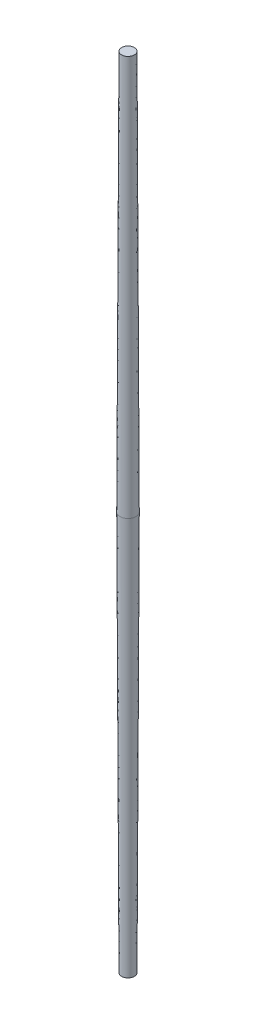
ISO-10303-21;
HEADER;
FILE_DESCRIPTION(('STEP AP214'),'2;1');
FILE_NAME('part.step','',(''),(''),'','','');
FILE_SCHEMA(('AUTOMOTIVE_DESIGN { 1 0 10303 214 1 1 1 1 }'));
ENDSEC;
DATA;
#1=APPLICATION_CONTEXT('core data for automotive mechanical design processes');
#2=APPLICATION_PROTOCOL_DEFINITION('international standard','automotive_design',2000,#1);
#3=PRODUCT_CONTEXT('',#1,'mechanical');
#4=PRODUCT('Part','Part','',(#3));
#5=PRODUCT_RELATED_PRODUCT_CATEGORY('part','',(#4));
#6=PRODUCT_DEFINITION_FORMATION('','',#4);
#7=PRODUCT_DEFINITION_CONTEXT('part definition',#1,'design');
#8=PRODUCT_DEFINITION('design','',#6,#7);
#9=PRODUCT_DEFINITION_SHAPE('','',#8);
#10=(LENGTH_UNIT() NAMED_UNIT(*) SI_UNIT(.MILLI.,.METRE.));
#11=(NAMED_UNIT(*) PLANE_ANGLE_UNIT() SI_UNIT($,.RADIAN.));
#12=(NAMED_UNIT(*) SI_UNIT($,.STERADIAN.) SOLID_ANGLE_UNIT());
#13=UNCERTAINTY_MEASURE_WITH_UNIT(LENGTH_MEASURE(1.E-05),#10,'distance_accuracy_value','');
#14=(GEOMETRIC_REPRESENTATION_CONTEXT(3) GLOBAL_UNCERTAINTY_ASSIGNED_CONTEXT((#13)) GLOBAL_UNIT_ASSIGNED_CONTEXT((#10,
#11,#12)) REPRESENTATION_CONTEXT('',''));
#15=CARTESIAN_POINT('',(0.,0.,0.));
#16=DIRECTION('',(0.,0.,1.));
#17=DIRECTION('',(1.,0.,0.));
#18=AXIS2_PLACEMENT_3D('',#15,#16,#17);
#19=CARTESIAN_POINT('',(0.,0.,0.));
#20=DIRECTION('',(0.,-1.,0.));
#21=DIRECTION('',(1.,0.,0.));
#22=AXIS2_PLACEMENT_3D('',#19,#20,#21);
#23=CONICAL_SURFACE('',#22,7.5,0.00399997866687154);
#24=CARTESIAN_POINT('',(0.,375.,0.));
#25=DIRECTION('',(0.,1.,0.));
#26=DIRECTION('',(-1.,0.,0.));
#27=AXIS2_PLACEMENT_3D('',#24,#25,#26);
#28=CIRCLE('',#27,5.99999999999997);
#29=CARTESIAN_POINT('',(-5.99999999999994,375.,0.));
#30=VERTEX_POINT('',#29);
#31=EDGE_CURVE('E10',#30,#30,#28,.T.);
#32=ORIENTED_EDGE('',*,*,#31,.F.);
#33=EDGE_LOOP('',(#32));
#34=FACE_BOUND('',#33,.T.);
#35=CARTESIAN_POINT('',(0.,0.,0.));
#36=DIRECTION('',(0.,1.,0.));
#37=DIRECTION('',(-1.,0.,0.));
#38=AXIS2_PLACEMENT_3D('',#35,#36,#37);
#39=CIRCLE('',#38,7.5);
#40=CARTESIAN_POINT('',(-7.5,0.,0.));
#41=VERTEX_POINT('',#40);
#42=EDGE_CURVE('E39',#41,#41,#39,.T.);
#43=ORIENTED_EDGE('',*,*,#42,.T.);
#44=EDGE_LOOP('',(#43));
#45=FACE_BOUND('',#44,.T.);
#46=ADVANCED_FACE('F33',(#34,#45),#23,.T.);
#47=CARTESIAN_POINT('',(6.,375.,0.));
#48=DIRECTION('',(0.,-1.,0.));
#49=DIRECTION('',(1.,0.,0.));
#50=AXIS2_PLACEMENT_3D('',#47,#48,#49);
#51=PLANE('',#50);
#52=ORIENTED_EDGE('',*,*,#31,.T.);
#53=EDGE_LOOP('',(#52));
#54=FACE_BOUND('',#53,.T.);
#55=ADVANCED_FACE('F59',(#54),#51,.F.);
#56=CARTESIAN_POINT('',(0.,0.,0.));
#57=DIRECTION('',(0.,1.,0.));
#58=DIRECTION('',(1.,0.,0.));
#59=AXIS2_PLACEMENT_3D('',#56,#57,#58);
#60=CONICAL_SURFACE('',#59,7.5,0.00399997866687154);
#61=CARTESIAN_POINT('',(0.,-375.,0.));
#62=DIRECTION('',(0.,1.,0.));
#63=DIRECTION('',(-1.,0.,0.));
#64=AXIS2_PLACEMENT_3D('',#61,#62,#63);
#65=CIRCLE('',#64,5.99999999999997);
#66=CARTESIAN_POINT('',(-6.,-375.,0.));
#67=VERTEX_POINT('',#66);
#68=EDGE_CURVE('E43',#67,#67,#65,.T.);
#69=ORIENTED_EDGE('',*,*,#68,.T.);
#70=EDGE_LOOP('',(#69));
#71=FACE_BOUND('',#70,.T.);
#72=ORIENTED_EDGE('',*,*,#42,.F.);
#73=EDGE_LOOP('',(#72));
#74=FACE_BOUND('',#73,.T.);
#75=ADVANCED_FACE('F50',(#71,#74),#60,.T.);
#76=CARTESIAN_POINT('',(5.99999999999995,-375.,0.));
#77=DIRECTION('',(0.,1.,0.));
#78=DIRECTION('',(1.,0.,0.));
#79=AXIS2_PLACEMENT_3D('',#76,#77,#78);
#80=PLANE('',#79);
#81=ORIENTED_EDGE('',*,*,#68,.F.);
#82=EDGE_LOOP('',(#81));
#83=FACE_BOUND('',#82,.T.);
#84=ADVANCED_FACE('F53',(#83),#80,.F.);
#85=CLOSED_SHELL('',(#46,#55,#75,#84));
#86=MANIFOLD_SOLID_BREP('B2',#85);
#87=ADVANCED_BREP_SHAPE_REPRESENTATION('',(#18,#86),#14);
#88=SHAPE_DEFINITION_REPRESENTATION(#9,#87);
ENDSEC;
END-ISO-10303-21;
